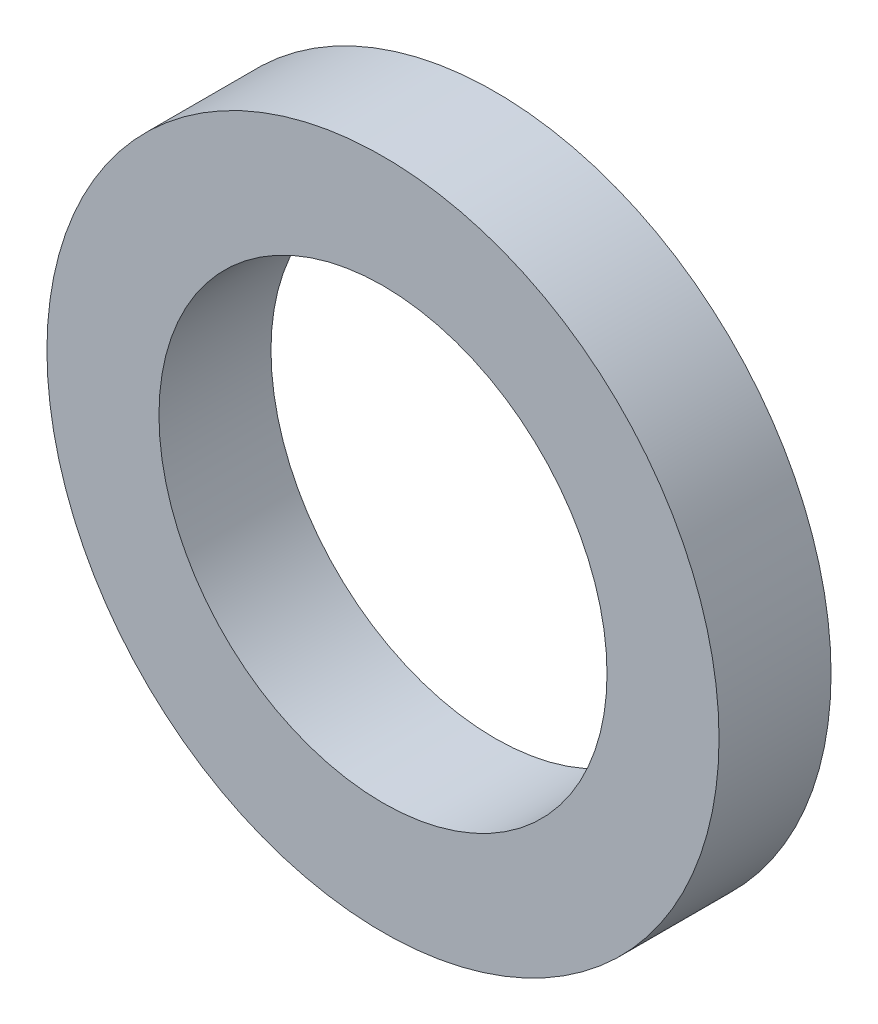
ISO-10303-21;
HEADER;
FILE_DESCRIPTION(('STEP AP214'),'2;1');
FILE_NAME('part.step','',(''),(''),'','','');
FILE_SCHEMA(('AUTOMOTIVE_DESIGN { 1 0 10303 214 1 1 1 1 }'));
ENDSEC;
DATA;
#1=APPLICATION_CONTEXT('core data for automotive mechanical design processes');
#2=APPLICATION_PROTOCOL_DEFINITION('international standard','automotive_design',2000,#1);
#3=PRODUCT_CONTEXT('',#1,'mechanical');
#4=PRODUCT('Part','Part','',(#3));
#5=PRODUCT_RELATED_PRODUCT_CATEGORY('part','',(#4));
#6=PRODUCT_DEFINITION_FORMATION('','',#4);
#7=PRODUCT_DEFINITION_CONTEXT('part definition',#1,'design');
#8=PRODUCT_DEFINITION('design','',#6,#7);
#9=PRODUCT_DEFINITION_SHAPE('','',#8);
#10=(LENGTH_UNIT() NAMED_UNIT(*) SI_UNIT(.MILLI.,.METRE.));
#11=(NAMED_UNIT(*) PLANE_ANGLE_UNIT() SI_UNIT($,.RADIAN.));
#12=(NAMED_UNIT(*) SI_UNIT($,.STERADIAN.) SOLID_ANGLE_UNIT());
#13=UNCERTAINTY_MEASURE_WITH_UNIT(LENGTH_MEASURE(1.E-05),#10,'distance_accuracy_value','');
#14=(GEOMETRIC_REPRESENTATION_CONTEXT(3) GLOBAL_UNCERTAINTY_ASSIGNED_CONTEXT((#13)) GLOBAL_UNIT_ASSIGNED_CONTEXT((#10,
#11,#12)) REPRESENTATION_CONTEXT('',''));
#15=CARTESIAN_POINT('',(0.,0.,0.));
#16=DIRECTION('',(0.,0.,1.));
#17=DIRECTION('',(1.,0.,0.));
#18=AXIS2_PLACEMENT_3D('',#15,#16,#17);
#19=CARTESIAN_POINT('',(0.,0.,5.));
#20=DIRECTION('',(0.,0.,-1.));
#21=DIRECTION('',(-1.,0.,0.));
#22=AXIS2_PLACEMENT_3D('',#19,#20,#21);
#23=CYLINDRICAL_SURFACE('',#22,15.);
#24=CARTESIAN_POINT('',(0.,0.,5.));
#25=DIRECTION('',(0.,0.,1.));
#26=DIRECTION('',(1.,0.,0.));
#27=AXIS2_PLACEMENT_3D('',#24,#25,#26);
#28=CIRCLE('',#27,15.);
#29=CARTESIAN_POINT('',(15.,0.,5.));
#30=VERTEX_POINT('',#29);
#31=EDGE_CURVE('E10',#30,#30,#28,.T.);
#32=ORIENTED_EDGE('',*,*,#31,.F.);
#33=EDGE_LOOP('',(#32));
#34=FACE_BOUND('',#33,.T.);
#35=CARTESIAN_POINT('',(0.,0.,0.));
#36=DIRECTION('',(0.,0.,1.));
#37=DIRECTION('',(1.,0.,0.));
#38=AXIS2_PLACEMENT_3D('',#35,#36,#37);
#39=CIRCLE('',#38,15.);
#40=CARTESIAN_POINT('',(15.,0.,0.));
#41=VERTEX_POINT('',#40);
#42=EDGE_CURVE('E40',#41,#41,#39,.T.);
#43=ORIENTED_EDGE('',*,*,#42,.T.);
#44=EDGE_LOOP('',(#43));
#45=FACE_BOUND('',#44,.T.);
#46=ADVANCED_FACE('F33',(#34,#45),#23,.T.);
#47=CARTESIAN_POINT('',(0.,0.,5.));
#48=DIRECTION('',(0.,0.,1.));
#49=DIRECTION('',(1.,0.,0.));
#50=AXIS2_PLACEMENT_3D('',#47,#48,#49);
#51=PLANE('',#50);
#52=CARTESIAN_POINT('',(0.,0.,5.));
#53=DIRECTION('',(0.,0.,1.));
#54=DIRECTION('',(1.,0.,0.));
#55=AXIS2_PLACEMENT_3D('',#52,#53,#54);
#56=CIRCLE('',#55,10.);
#57=CARTESIAN_POINT('',(10.,0.,5.));
#58=VERTEX_POINT('',#57);
#59=EDGE_CURVE('E46',#58,#58,#56,.T.);
#60=ORIENTED_EDGE('',*,*,#59,.F.);
#61=EDGE_LOOP('',(#60));
#62=FACE_BOUND('',#61,.T.);
#63=ORIENTED_EDGE('',*,*,#31,.T.);
#64=EDGE_LOOP('',(#63));
#65=FACE_BOUND('',#64,.T.);
#66=ADVANCED_FACE('F62',(#62,#65),#51,.T.);
#67=CARTESIAN_POINT('',(0.,0.,0.));
#68=DIRECTION('',(0.,0.,1.));
#69=DIRECTION('',(1.,0.,0.));
#70=AXIS2_PLACEMENT_3D('',#67,#68,#69);
#71=PLANE('',#70);
#72=CARTESIAN_POINT('',(0.,0.,0.));
#73=DIRECTION('',(0.,0.,1.));
#74=DIRECTION('',(1.,0.,0.));
#75=AXIS2_PLACEMENT_3D('',#72,#73,#74);
#76=CIRCLE('',#75,10.);
#77=CARTESIAN_POINT('',(10.,0.,0.));
#78=VERTEX_POINT('',#77);
#79=EDGE_CURVE('E36',#78,#78,#76,.T.);
#80=ORIENTED_EDGE('',*,*,#79,.T.);
#81=EDGE_LOOP('',(#80));
#82=FACE_BOUND('',#81,.T.);
#83=ORIENTED_EDGE('',*,*,#42,.F.);
#84=EDGE_LOOP('',(#83));
#85=FACE_BOUND('',#84,.T.);
#86=ADVANCED_FACE('F53',(#82,#85),#71,.F.);
#87=CARTESIAN_POINT('',(0.,0.,-15.));
#88=DIRECTION('',(0.,0.,1.));
#89=DIRECTION('',(1.,0.,0.));
#90=AXIS2_PLACEMENT_3D('',#87,#88,#89);
#91=CYLINDRICAL_SURFACE('',#90,10.);
#92=ORIENTED_EDGE('',*,*,#59,.T.);
#93=EDGE_LOOP('',(#92));
#94=FACE_BOUND('',#93,.T.);
#95=ORIENTED_EDGE('',*,*,#79,.F.);
#96=EDGE_LOOP('',(#95));
#97=FACE_BOUND('',#96,.T.);
#98=ADVANCED_FACE('F56',(#94,#97),#91,.F.);
#99=CLOSED_SHELL('',(#46,#66,#86,#98));
#100=MANIFOLD_SOLID_BREP('B2',#99);
#101=ADVANCED_BREP_SHAPE_REPRESENTATION('',(#18,#100),#14);
#102=SHAPE_DEFINITION_REPRESENTATION(#9,#101);
ENDSEC;
END-ISO-10303-21;
